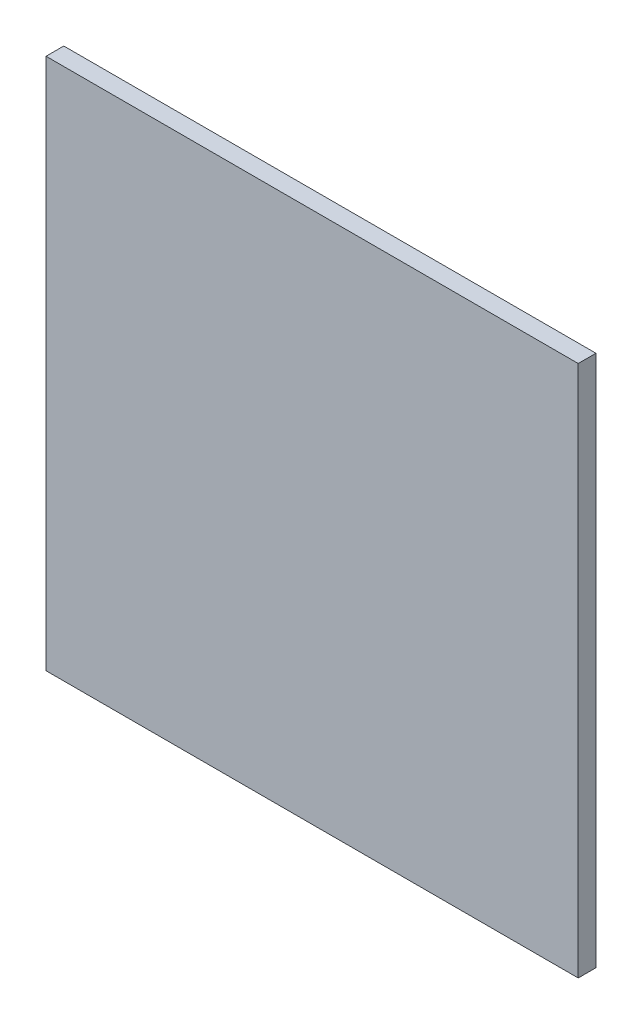
ISO-10303-21;
HEADER;
FILE_DESCRIPTION(('STEP AP214'),'2;1');
FILE_NAME('part.step','',(''),(''),'','','');
FILE_SCHEMA(('AUTOMOTIVE_DESIGN { 1 0 10303 214 1 1 1 1 }'));
ENDSEC;
DATA;
#1=APPLICATION_CONTEXT('core data for automotive mechanical design processes');
#2=APPLICATION_PROTOCOL_DEFINITION('international standard','automotive_design',2000,#1);
#3=PRODUCT_CONTEXT('',#1,'mechanical');
#4=PRODUCT('Part','Part','',(#3));
#5=PRODUCT_RELATED_PRODUCT_CATEGORY('part','',(#4));
#6=PRODUCT_DEFINITION_FORMATION('','',#4);
#7=PRODUCT_DEFINITION_CONTEXT('part definition',#1,'design');
#8=PRODUCT_DEFINITION('design','',#6,#7);
#9=PRODUCT_DEFINITION_SHAPE('','',#8);
#10=(LENGTH_UNIT() NAMED_UNIT(*) SI_UNIT(.MILLI.,.METRE.));
#11=(NAMED_UNIT(*) PLANE_ANGLE_UNIT() SI_UNIT($,.RADIAN.));
#12=(NAMED_UNIT(*) SI_UNIT($,.STERADIAN.) SOLID_ANGLE_UNIT());
#13=UNCERTAINTY_MEASURE_WITH_UNIT(LENGTH_MEASURE(1.E-05),#10,'distance_accuracy_value','');
#14=(GEOMETRIC_REPRESENTATION_CONTEXT(3) GLOBAL_UNCERTAINTY_ASSIGNED_CONTEXT((#13)) GLOBAL_UNIT_ASSIGNED_CONTEXT((#10,
#11,#12)) REPRESENTATION_CONTEXT('',''));
#15=CARTESIAN_POINT('',(0.,0.,0.));
#16=DIRECTION('',(0.,0.,1.));
#17=DIRECTION('',(1.,0.,0.));
#18=AXIS2_PLACEMENT_3D('',#15,#16,#17);
#19=CARTESIAN_POINT('',(0.,0.,2.54));
#20=DIRECTION('',(1.,0.,0.));
#21=DIRECTION('',(0.,0.,-1.));
#22=AXIS2_PLACEMENT_3D('',#19,#20,#21);
#23=PLANE('',#22);
#24=DIRECTION('',(0.,-1.,0.));
#25=VECTOR('',#24,1.);
#26=CARTESIAN_POINT('',(0.,0.,0.));
#27=LINE('',#26,#25);
#28=CARTESIAN_POINT('',(0.,76.2,0.));
#29=VERTEX_POINT('',#28);
#30=CARTESIAN_POINT('',(0.,0.,0.));
#31=VERTEX_POINT('',#30);
#32=EDGE_CURVE('E96',#29,#31,#27,.T.);
#33=ORIENTED_EDGE('',*,*,#32,.T.);
#34=DIRECTION('',(0.,0.,-1.));
#35=VECTOR('',#34,1.);
#36=CARTESIAN_POINT('',(0.,0.,2.54));
#37=LINE('',#36,#35);
#38=CARTESIAN_POINT('',(0.,0.,2.54));
#39=VERTEX_POINT('',#38);
#40=EDGE_CURVE('E11',#39,#31,#37,.T.);
#41=ORIENTED_EDGE('',*,*,#40,.F.);
#42=DIRECTION('',(0.,-1.,0.));
#43=VECTOR('',#42,1.);
#44=CARTESIAN_POINT('',(0.,0.,2.54));
#45=LINE('',#44,#43);
#46=CARTESIAN_POINT('',(0.,76.2,2.54));
#47=VERTEX_POINT('',#46);
#48=EDGE_CURVE('E84',#47,#39,#45,.T.);
#49=ORIENTED_EDGE('',*,*,#48,.F.);
#50=DIRECTION('',(0.,0.,-1.));
#51=VECTOR('',#50,1.);
#52=CARTESIAN_POINT('',(0.,76.2,2.54));
#53=LINE('',#52,#51);
#54=EDGE_CURVE('E92',#47,#29,#53,.T.);
#55=ORIENTED_EDGE('',*,*,#54,.T.);
#56=EDGE_LOOP('',(#33,#41,#49,#55));
#57=FACE_BOUND('',#56,.T.);
#58=ADVANCED_FACE('F33',(#57),#23,.F.);
#59=CARTESIAN_POINT('',(0.,0.,2.54));
#60=DIRECTION('',(0.,1.,0.));
#61=DIRECTION('',(0.,0.,1.));
#62=AXIS2_PLACEMENT_3D('',#59,#60,#61);
#63=PLANE('',#62);
#64=DIRECTION('',(1.,0.,0.));
#65=VECTOR('',#64,1.);
#66=CARTESIAN_POINT('',(0.,0.,0.));
#67=LINE('',#66,#65);
#68=CARTESIAN_POINT('',(76.2,0.,0.));
#69=VERTEX_POINT('',#68);
#70=EDGE_CURVE('E88',#31,#69,#67,.T.);
#71=ORIENTED_EDGE('',*,*,#70,.T.);
#72=DIRECTION('',(0.,0.,-1.));
#73=VECTOR('',#72,1.);
#74=CARTESIAN_POINT('',(76.2,0.,2.54));
#75=LINE('',#74,#73);
#76=CARTESIAN_POINT('',(76.2,0.,2.54));
#77=VERTEX_POINT('',#76);
#78=EDGE_CURVE('E41',#77,#69,#75,.T.);
#79=ORIENTED_EDGE('',*,*,#78,.F.);
#80=DIRECTION('',(1.,0.,0.));
#81=VECTOR('',#80,1.);
#82=CARTESIAN_POINT('',(0.,0.,2.54));
#83=LINE('',#82,#81);
#84=EDGE_CURVE('E79',#39,#77,#83,.T.);
#85=ORIENTED_EDGE('',*,*,#84,.F.);
#86=ORIENTED_EDGE('',*,*,#40,.T.);
#87=EDGE_LOOP('',(#71,#79,#85,#86));
#88=FACE_BOUND('',#87,.T.);
#89=ADVANCED_FACE('F87',(#88),#63,.F.);
#90=CARTESIAN_POINT('',(76.2,0.,2.54));
#91=DIRECTION('',(-1.,0.,0.));
#92=DIRECTION('',(0.,0.,1.));
#93=AXIS2_PLACEMENT_3D('',#90,#91,#92);
#94=PLANE('',#93);
#95=DIRECTION('',(0.,1.,0.));
#96=VECTOR('',#95,1.);
#97=CARTESIAN_POINT('',(76.2,0.,0.));
#98=LINE('',#97,#96);
#99=CARTESIAN_POINT('',(76.2,76.2,0.));
#100=VERTEX_POINT('',#99);
#101=EDGE_CURVE('E66',#69,#100,#98,.T.);
#102=ORIENTED_EDGE('',*,*,#101,.T.);
#103=DIRECTION('',(0.,0.,-1.));
#104=VECTOR('',#103,1.);
#105=CARTESIAN_POINT('',(76.2,76.2,2.54));
#106=LINE('',#105,#104);
#107=CARTESIAN_POINT('',(76.2,76.2,2.54));
#108=VERTEX_POINT('',#107);
#109=EDGE_CURVE('E89',#108,#100,#106,.T.);
#110=ORIENTED_EDGE('',*,*,#109,.F.);
#111=DIRECTION('',(0.,1.,0.));
#112=VECTOR('',#111,1.);
#113=CARTESIAN_POINT('',(76.2,0.,2.54));
#114=LINE('',#113,#112);
#115=EDGE_CURVE('E82',#77,#108,#114,.T.);
#116=ORIENTED_EDGE('',*,*,#115,.F.);
#117=ORIENTED_EDGE('',*,*,#78,.T.);
#118=EDGE_LOOP('',(#102,#110,#116,#117));
#119=FACE_BOUND('',#118,.T.);
#120=ADVANCED_FACE('F90',(#119),#94,.F.);
#121=CARTESIAN_POINT('',(0.,76.2,2.54));
#122=DIRECTION('',(0.,-1.,0.));
#123=DIRECTION('',(0.,0.,-1.));
#124=AXIS2_PLACEMENT_3D('',#121,#122,#123);
#125=PLANE('',#124);
#126=DIRECTION('',(-1.,0.,0.));
#127=VECTOR('',#126,1.);
#128=CARTESIAN_POINT('',(0.,76.2,0.));
#129=LINE('',#128,#127);
#130=EDGE_CURVE('E72',#100,#29,#129,.T.);
#131=ORIENTED_EDGE('',*,*,#130,.T.);
#132=ORIENTED_EDGE('',*,*,#54,.F.);
#133=DIRECTION('',(-1.,0.,0.));
#134=VECTOR('',#133,1.);
#135=CARTESIAN_POINT('',(0.,76.2,2.54));
#136=LINE('',#135,#134);
#137=EDGE_CURVE('E49',#108,#47,#136,.T.);
#138=ORIENTED_EDGE('',*,*,#137,.F.);
#139=ORIENTED_EDGE('',*,*,#109,.T.);
#140=EDGE_LOOP('',(#131,#132,#138,#139));
#141=FACE_BOUND('',#140,.T.);
#142=ADVANCED_FACE('F103',(#141),#125,.F.);
#143=CARTESIAN_POINT('',(0.,0.,2.54));
#144=DIRECTION('',(0.,0.,-1.));
#145=DIRECTION('',(-1.,0.,0.));
#146=AXIS2_PLACEMENT_3D('',#143,#144,#145);
#147=PLANE('',#146);
#148=ORIENTED_EDGE('',*,*,#48,.T.);
#149=ORIENTED_EDGE('',*,*,#84,.T.);
#150=ORIENTED_EDGE('',*,*,#115,.T.);
#151=ORIENTED_EDGE('',*,*,#137,.T.);
#152=EDGE_LOOP('',(#148,#149,#150,#151));
#153=FACE_BOUND('',#152,.T.);
#154=ADVANCED_FACE('F80',(#153),#147,.F.);
#155=CARTESIAN_POINT('',(0.,0.,0.));
#156=DIRECTION('',(0.,0.,-1.));
#157=DIRECTION('',(-1.,0.,0.));
#158=AXIS2_PLACEMENT_3D('',#155,#156,#157);
#159=PLANE('',#158);
#160=ORIENTED_EDGE('',*,*,#32,.F.);
#161=ORIENTED_EDGE('',*,*,#130,.F.);
#162=ORIENTED_EDGE('',*,*,#101,.F.);
#163=ORIENTED_EDGE('',*,*,#70,.F.);
#164=EDGE_LOOP('',(#160,#161,#162,#163));
#165=FACE_BOUND('',#164,.T.);
#166=ADVANCED_FACE('F106',(#165),#159,.T.);
#167=CLOSED_SHELL('',(#58,#89,#120,#142,#154,#166));
#168=MANIFOLD_SOLID_BREP('B2',#167);
#169=ADVANCED_BREP_SHAPE_REPRESENTATION('',(#18,#168),#14);
#170=SHAPE_DEFINITION_REPRESENTATION(#9,#169);
ENDSEC;
END-ISO-10303-21;
